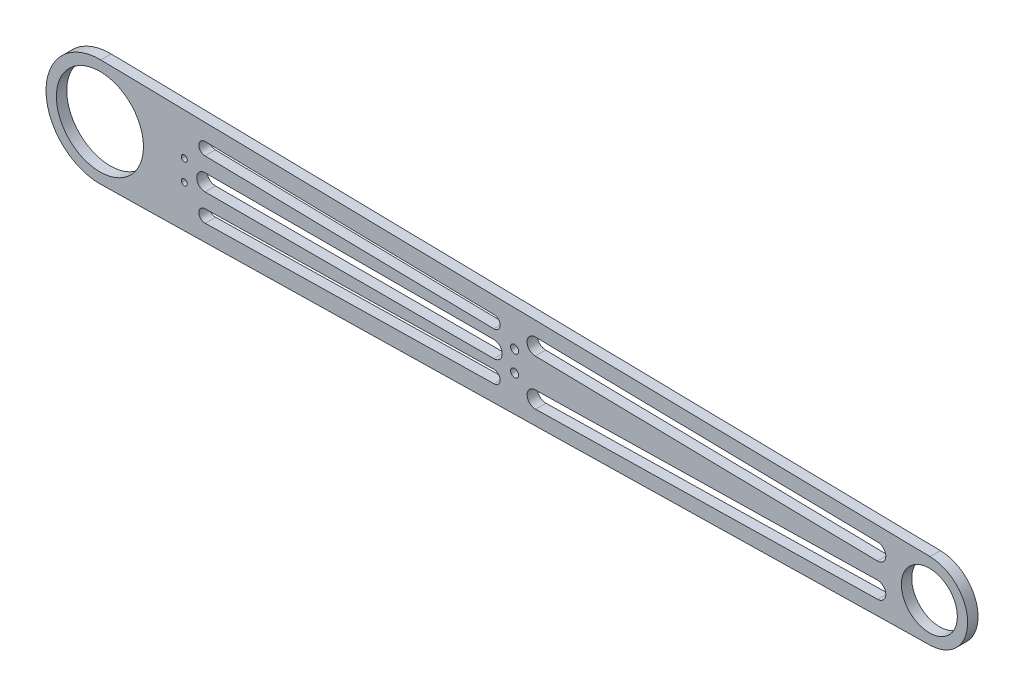
ISO-10303-21;
HEADER;
FILE_DESCRIPTION(('STEP AP214'),'2;1');
FILE_NAME('part.step','',(''),(''),'','','');
FILE_SCHEMA(('AUTOMOTIVE_DESIGN { 1 0 10303 214 1 1 1 1 }'));
ENDSEC;
DATA;
#1=APPLICATION_CONTEXT('core data for automotive mechanical design processes');
#2=APPLICATION_PROTOCOL_DEFINITION('international standard','automotive_design',2000,#1);
#3=PRODUCT_CONTEXT('',#1,'mechanical');
#4=PRODUCT('Part','Part','',(#3));
#5=PRODUCT_RELATED_PRODUCT_CATEGORY('part','',(#4));
#6=PRODUCT_DEFINITION_FORMATION('','',#4);
#7=PRODUCT_DEFINITION_CONTEXT('part definition',#1,'design');
#8=PRODUCT_DEFINITION('design','',#6,#7);
#9=PRODUCT_DEFINITION_SHAPE('','',#8);
#10=(LENGTH_UNIT() NAMED_UNIT(*) SI_UNIT(.MILLI.,.METRE.));
#11=(NAMED_UNIT(*) PLANE_ANGLE_UNIT() SI_UNIT($,.RADIAN.));
#12=(NAMED_UNIT(*) SI_UNIT($,.STERADIAN.) SOLID_ANGLE_UNIT());
#13=UNCERTAINTY_MEASURE_WITH_UNIT(LENGTH_MEASURE(1.E-05),#10,'distance_accuracy_value','');
#14=(GEOMETRIC_REPRESENTATION_CONTEXT(3) GLOBAL_UNCERTAINTY_ASSIGNED_CONTEXT((#13)) GLOBAL_UNIT_ASSIGNED_CONTEXT((#10,
#11,#12)) REPRESENTATION_CONTEXT('',''));
#15=CARTESIAN_POINT('',(0.,0.,0.));
#16=DIRECTION('',(0.,0.,1.));
#17=DIRECTION('',(1.,0.,0.));
#18=AXIS2_PLACEMENT_3D('',#15,#16,#17);
#19=CARTESIAN_POINT('',(0.,0.,5.));
#20=DIRECTION('',(0.,0.,1.));
#21=DIRECTION('',(1.,0.,0.));
#22=AXIS2_PLACEMENT_3D('',#19,#20,#21);
#23=PLANE('',#22);
#24=CARTESIAN_POINT('',(50.6939798987516,0.,5.));
#25=DIRECTION('',(0.,0.,1.));
#26=DIRECTION('',(1.,0.,0.));
#27=AXIS2_PLACEMENT_3D('',#24,#25,#26);
#28=CIRCLE('',#27,4.);
#29=CARTESIAN_POINT('',(50.6939798987516,4.,5.));
#30=VERTEX_POINT('',#29);
#31=CARTESIAN_POINT('',(50.6939798987516,-4.,5.));
#32=VERTEX_POINT('',#31);
#33=EDGE_CURVE('E56',#30,#32,#28,.T.);
#34=ORIENTED_EDGE('',*,*,#33,.F.);
#35=DIRECTION('',(-1.,0.,0.));
#36=VECTOR('',#35,1.);
#37=CARTESIAN_POINT('',(50.6939798987516,4.,5.));
#38=LINE('',#37,#36);
#39=CARTESIAN_POINT('',(190.,4.,5.));
#40=VERTEX_POINT('',#39);
#41=EDGE_CURVE('E314',#40,#30,#38,.T.);
#42=ORIENTED_EDGE('',*,*,#41,.F.);
#43=CARTESIAN_POINT('',(190.,0.,5.));
#44=DIRECTION('',(0.,0.,1.));
#45=DIRECTION('',(1.,0.,0.));
#46=AXIS2_PLACEMENT_3D('',#43,#44,#45);
#47=CIRCLE('',#46,4.);
#48=CARTESIAN_POINT('',(190.,-4.,5.));
#49=VERTEX_POINT('',#48);
#50=EDGE_CURVE('E317',#49,#40,#47,.T.);
#51=ORIENTED_EDGE('',*,*,#50,.F.);
#52=DIRECTION('',(1.,0.,0.));
#53=VECTOR('',#52,1.);
#54=CARTESIAN_POINT('',(50.6939798987516,-4.,5.));
#55=LINE('',#54,#53);
#56=EDGE_CURVE('E321',#32,#49,#55,.T.);
#57=ORIENTED_EDGE('',*,*,#56,.F.);
#58=EDGE_LOOP('',(#34,#42,#51,#57));
#59=FACE_BOUND('',#58,.T.);
#60=CARTESIAN_POINT('',(50.6939798987516,-14.0519581648038,5.));
#61=DIRECTION('',(0.,0.,1.));
#62=DIRECTION('',(-1.,0.,0.));
#63=AXIS2_PLACEMENT_3D('',#60,#61,#62);
#64=CIRCLE('',#63,3.);
#65=CARTESIAN_POINT('',(50.6377298987516,-11.0524855549105,5.));
#66=VERTEX_POINT('',#65);
#67=CARTESIAN_POINT('',(50.7502298987516,-17.0514307746971,5.));
#68=VERTEX_POINT('',#67);
#69=EDGE_CURVE('E64',#66,#68,#64,.T.);
#70=ORIENTED_EDGE('',*,*,#69,.F.);
#71=DIRECTION('',(-0.99982420329776,-0.0187499999999999,0.));
#72=VECTOR('',#71,1.);
#73=CARTESIAN_POINT('',(50.6377298987516,-11.0524855549105,5.));
#74=LINE('',#73,#72);
#75=CARTESIAN_POINT('',(189.94375,-8.44003841842077,5.));
#76=VERTEX_POINT('',#75);
#77=EDGE_CURVE('E284',#76,#66,#74,.T.);
#78=ORIENTED_EDGE('',*,*,#77,.F.);
#79=CARTESIAN_POINT('',(190.,-11.439511028314,5.));
#80=DIRECTION('',(0.,0.,1.));
#81=DIRECTION('',(-1.,0.,0.));
#82=AXIS2_PLACEMENT_3D('',#79,#80,#81);
#83=CIRCLE('',#82,2.99999999999999);
#84=CARTESIAN_POINT('',(190.05625,-14.4389836382073,5.));
#85=VERTEX_POINT('',#84);
#86=EDGE_CURVE('E287',#85,#76,#83,.T.);
#87=ORIENTED_EDGE('',*,*,#86,.F.);
#88=DIRECTION('',(0.99982420329776,0.0187499999999999,0.));
#89=VECTOR('',#88,1.);
#90=CARTESIAN_POINT('',(50.7502298987516,-17.0514307746971,5.));
#91=LINE('',#90,#89);
#92=EDGE_CURVE('E291',#68,#85,#91,.T.);
#93=ORIENTED_EDGE('',*,*,#92,.F.);
#94=EDGE_LOOP('',(#70,#78,#87,#93));
#95=FACE_BOUND('',#94,.T.);
#96=CARTESIAN_POINT('',(210.,-11.0644450929595,5.));
#97=DIRECTION('',(0.,0.,1.));
#98=DIRECTION('',(-1.,0.,0.));
#99=AXIS2_PLACEMENT_3D('',#96,#97,#98);
#100=CIRCLE('',#99,4.00000000000001);
#101=CARTESIAN_POINT('',(209.925,-7.06514827976842,5.));
#102=VERTEX_POINT('',#101);
#103=CARTESIAN_POINT('',(210.075,-15.0637419061505,5.));
#104=VERTEX_POINT('',#103);
#105=EDGE_CURVE('E213',#102,#104,#100,.T.);
#106=ORIENTED_EDGE('',*,*,#105,.F.);
#107=DIRECTION('',(-0.99982420329776,-0.0187499999999999,0.));
#108=VECTOR('',#107,1.);
#109=CARTESIAN_POINT('',(209.925,-7.06514827976842,5.));
#110=LINE('',#109,#108);
#111=CARTESIAN_POINT('',(374.925,-3.97085431309334,5.));
#112=VERTEX_POINT('',#111);
#113=EDGE_CURVE('E254',#112,#102,#110,.T.);
#114=ORIENTED_EDGE('',*,*,#113,.F.);
#115=CARTESIAN_POINT('',(375.,-7.97015112628439,5.));
#116=DIRECTION('',(0.,0.,1.));
#117=DIRECTION('',(-1.,0.,0.));
#118=AXIS2_PLACEMENT_3D('',#115,#116,#117);
#119=CIRCLE('',#118,4.00000000000001);
#120=CARTESIAN_POINT('',(375.075,-11.9694479394754,5.));
#121=VERTEX_POINT('',#120);
#122=EDGE_CURVE('E257',#121,#112,#119,.T.);
#123=ORIENTED_EDGE('',*,*,#122,.F.);
#124=DIRECTION('',(0.99982420329776,0.0187499999999998,0.));
#125=VECTOR('',#124,1.);
#126=CARTESIAN_POINT('',(210.075,-15.0637419061505,5.));
#127=LINE('',#126,#125);
#128=EDGE_CURVE('E261',#104,#121,#127,.T.);
#129=ORIENTED_EDGE('',*,*,#128,.F.);
#130=EDGE_LOOP('',(#106,#114,#123,#129));
#131=FACE_BOUND('',#130,.T.);
#132=CARTESIAN_POINT('',(210.,11.0644450929595,5.));
#133=DIRECTION('',(0.,0.,1.));
#134=DIRECTION('',(1.,0.,0.));
#135=AXIS2_PLACEMENT_3D('',#132,#133,#134);
#136=CIRCLE('',#135,4.00000000000001);
#137=CARTESIAN_POINT('',(210.075,15.0637419061505,5.));
#138=VERTEX_POINT('',#137);
#139=CARTESIAN_POINT('',(209.925,7.06514827976843,5.));
#140=VERTEX_POINT('',#139);
#141=EDGE_CURVE('E205',#138,#140,#136,.T.);
#142=ORIENTED_EDGE('',*,*,#141,.F.);
#143=DIRECTION('',(-0.99982420329776,0.0187499999999998,0.));
#144=VECTOR('',#143,1.);
#145=CARTESIAN_POINT('',(210.075,15.0637419061505,5.));
#146=LINE('',#145,#144);
#147=CARTESIAN_POINT('',(375.075,11.9694479394754,5.));
#148=VERTEX_POINT('',#147);
#149=EDGE_CURVE('E216',#148,#138,#146,.T.);
#150=ORIENTED_EDGE('',*,*,#149,.F.);
#151=CARTESIAN_POINT('',(375.,7.97015112628439,5.));
#152=DIRECTION('',(0.,0.,1.));
#153=DIRECTION('',(1.,0.,0.));
#154=AXIS2_PLACEMENT_3D('',#151,#152,#153);
#155=CIRCLE('',#154,4.00000000000001);
#156=CARTESIAN_POINT('',(374.925,3.97085431309334,5.));
#157=VERTEX_POINT('',#156);
#158=EDGE_CURVE('E221',#157,#148,#155,.T.);
#159=ORIENTED_EDGE('',*,*,#158,.F.);
#160=DIRECTION('',(0.99982420329776,-0.0187499999999999,0.));
#161=VECTOR('',#160,1.);
#162=CARTESIAN_POINT('',(209.925,7.06514827976842,5.));
#163=LINE('',#162,#161);
#164=EDGE_CURVE('E226',#140,#157,#163,.T.);
#165=ORIENTED_EDGE('',*,*,#164,.F.);
#166=EDGE_LOOP('',(#142,#150,#159,#165));
#167=FACE_BOUND('',#166,.T.);
#168=CARTESIAN_POINT('',(50.6939798987516,14.0519581648038,5.));
#169=DIRECTION('',(0.,0.,1.));
#170=DIRECTION('',(1.,0.,0.));
#171=AXIS2_PLACEMENT_3D('',#168,#169,#170);
#172=CIRCLE('',#171,3.);
#173=CARTESIAN_POINT('',(50.7502298987516,17.0514307746971,5.));
#174=VERTEX_POINT('',#173);
#175=CARTESIAN_POINT('',(50.6377298987516,11.0524855549105,5.));
#176=VERTEX_POINT('',#175);
#177=EDGE_CURVE('E227',#174,#176,#172,.T.);
#178=ORIENTED_EDGE('',*,*,#177,.F.);
#179=DIRECTION('',(-0.99982420329776,0.0187499999999999,0.));
#180=VECTOR('',#179,1.);
#181=CARTESIAN_POINT('',(50.7502298987516,17.0514307746971,5.));
#182=LINE('',#181,#180);
#183=CARTESIAN_POINT('',(190.05625,14.4389836382073,5.));
#184=VERTEX_POINT('',#183);
#185=EDGE_CURVE('E339',#184,#174,#182,.T.);
#186=ORIENTED_EDGE('',*,*,#185,.F.);
#187=CARTESIAN_POINT('',(190.,11.439511028314,5.));
#188=DIRECTION('',(0.,0.,1.));
#189=DIRECTION('',(1.,0.,0.));
#190=AXIS2_PLACEMENT_3D('',#187,#188,#189);
#191=CIRCLE('',#190,2.99999999999999);
#192=CARTESIAN_POINT('',(189.94375,8.44003841842077,5.));
#193=VERTEX_POINT('',#192);
#194=EDGE_CURVE('E351',#193,#184,#191,.T.);
#195=ORIENTED_EDGE('',*,*,#194,.F.);
#196=DIRECTION('',(0.99982420329776,-0.0187499999999999,0.));
#197=VECTOR('',#196,1.);
#198=CARTESIAN_POINT('',(50.6377298987516,11.0524855549105,5.));
#199=LINE('',#198,#197);
#200=EDGE_CURVE('E229',#176,#193,#199,.T.);
#201=ORIENTED_EDGE('',*,*,#200,.F.);
#202=EDGE_LOOP('',(#178,#186,#195,#201));
#203=FACE_BOUND('',#202,.T.);
#204=CARTESIAN_POINT('',(200.,5.,5.));
#205=DIRECTION('',(0.,0.,-1.));
#206=DIRECTION('',(-1.,0.,0.));
#207=AXIS2_PLACEMENT_3D('',#204,#205,#206);
#208=CIRCLE('',#207,1.95);
#209=CARTESIAN_POINT('',(198.05,5.,5.));
#210=VERTEX_POINT('',#209);
#211=EDGE_CURVE('E365',#210,#210,#208,.T.);
#212=ORIENTED_EDGE('',*,*,#211,.T.);
#213=EDGE_LOOP('',(#212));
#214=FACE_BOUND('',#213,.T.);
#215=CARTESIAN_POINT('',(200.,-5.,5.));
#216=DIRECTION('',(0.,0.,-1.));
#217=DIRECTION('',(1.,0.,0.));
#218=AXIS2_PLACEMENT_3D('',#215,#216,#217);
#219=CIRCLE('',#218,1.95);
#220=CARTESIAN_POINT('',(201.95,-5.,5.));
#221=VERTEX_POINT('',#220);
#222=EDGE_CURVE('E358',#221,#221,#219,.T.);
#223=ORIENTED_EDGE('',*,*,#222,.T.);
#224=EDGE_LOOP('',(#223));
#225=FACE_BOUND('',#224,.T.);
#226=CARTESIAN_POINT('',(40.6939798987516,-5.00000000000001,5.));
#227=DIRECTION('',(0.,0.,-1.));
#228=DIRECTION('',(-1.,0.,0.));
#229=AXIS2_PLACEMENT_3D('',#226,#227,#228);
#230=CIRCLE('',#229,1.45);
#231=CARTESIAN_POINT('',(39.2439798987516,-5.00000000000001,5.));
#232=VERTEX_POINT('',#231);
#233=EDGE_CURVE('E377',#232,#232,#230,.T.);
#234=ORIENTED_EDGE('',*,*,#233,.T.);
#235=EDGE_LOOP('',(#234));
#236=FACE_BOUND('',#235,.T.);
#237=CARTESIAN_POINT('',(40.6939798987516,4.99999999999999,5.));
#238=DIRECTION('',(0.,0.,-1.));
#239=DIRECTION('',(1.,0.,0.));
#240=AXIS2_PLACEMENT_3D('',#237,#238,#239);
#241=CIRCLE('',#240,1.45);
#242=CARTESIAN_POINT('',(42.1439798987516,4.99999999999999,5.));
#243=VERTEX_POINT('',#242);
#244=EDGE_CURVE('E368',#243,#243,#241,.T.);
#245=ORIENTED_EDGE('',*,*,#244,.T.);
#246=EDGE_LOOP('',(#245));
#247=FACE_BOUND('',#246,.T.);
#248=CARTESIAN_POINT('',(0.,0.,5.));
#249=DIRECTION('',(0.,0.,1.));
#250=DIRECTION('',(1.,0.,0.));
#251=AXIS2_PLACEMENT_3D('',#248,#249,#250);
#252=CIRCLE('',#251,21.);
#253=CARTESIAN_POINT('',(21.,0.,5.));
#254=VERTEX_POINT('',#253);
#255=EDGE_CURVE('E395',#254,#254,#252,.T.);
#256=ORIENTED_EDGE('',*,*,#255,.F.);
#257=EDGE_LOOP('',(#256));
#258=FACE_BOUND('',#257,.T.);
#259=CARTESIAN_POINT('',(0.,0.,5.));
#260=DIRECTION('',(0.,0.,1.));
#261=DIRECTION('',(1.,0.,0.));
#262=AXIS2_PLACEMENT_3D('',#259,#260,#261);
#263=CIRCLE('',#262,26.);
#264=CARTESIAN_POINT('',(0.4875,25.9954292857418,5.));
#265=VERTEX_POINT('',#264);
#266=CARTESIAN_POINT('',(0.4875,-25.9954292857418,5.));
#267=VERTEX_POINT('',#266);
#268=EDGE_CURVE('E401',#265,#267,#263,.T.);
#269=ORIENTED_EDGE('',*,*,#268,.T.);
#270=DIRECTION('',(0.99982420329776,0.01875,0.));
#271=VECTOR('',#270,1.);
#272=CARTESIAN_POINT('',(0.4875,-25.9954292857418,5.));
#273=LINE('',#272,#271);
#274=CARTESIAN_POINT('',(400.346875,-18.4967477610086,5.));
#275=VERTEX_POINT('',#274);
#276=EDGE_CURVE('E404',#267,#275,#273,.T.);
#277=ORIENTED_EDGE('',*,*,#276,.T.);
#278=CARTESIAN_POINT('',(400.,0.,5.));
#279=DIRECTION('',(0.,0.,1.));
#280=DIRECTION('',(1.,0.,0.));
#281=AXIS2_PLACEMENT_3D('',#278,#279,#280);
#282=CIRCLE('',#281,18.5);
#283=CARTESIAN_POINT('',(400.346875,18.4967477610086,5.));
#284=VERTEX_POINT('',#283);
#285=EDGE_CURVE('E407',#275,#284,#282,.T.);
#286=ORIENTED_EDGE('',*,*,#285,.T.);
#287=DIRECTION('',(-0.99982420329776,0.01875,0.));
#288=VECTOR('',#287,1.);
#289=CARTESIAN_POINT('',(400.346875,18.4967477610086,5.));
#290=LINE('',#289,#288);
#291=EDGE_CURVE('E409',#284,#265,#290,.T.);
#292=ORIENTED_EDGE('',*,*,#291,.T.);
#293=EDGE_LOOP('',(#269,#277,#286,#292));
#294=FACE_BOUND('',#293,.T.);
#295=CARTESIAN_POINT('',(400.,0.,5.));
#296=DIRECTION('',(0.,0.,1.));
#297=DIRECTION('',(1.,0.,0.));
#298=AXIS2_PLACEMENT_3D('',#295,#296,#297);
#299=CIRCLE('',#298,13.5);
#300=CARTESIAN_POINT('',(413.5,0.,5.));
#301=VERTEX_POINT('',#300);
#302=EDGE_CURVE('E389',#301,#301,#299,.T.);
#303=ORIENTED_EDGE('',*,*,#302,.F.);
#304=EDGE_LOOP('',(#303));
#305=FACE_BOUND('',#304,.T.);
#306=ADVANCED_FACE('F41',(#59,#95,#131,#167,#203,#214,#225,#236,#247,#258,#294,#305),#23,.T.);
#307=CARTESIAN_POINT('',(0.,0.,0.));
#308=DIRECTION('',(0.,0.,1.));
#309=DIRECTION('',(1.,0.,0.));
#310=AXIS2_PLACEMENT_3D('',#307,#308,#309);
#311=PLANE('',#310);
#312=DIRECTION('',(-1.,0.,0.));
#313=VECTOR('',#312,1.);
#314=CARTESIAN_POINT('',(50.6939798987516,4.,0.));
#315=LINE('',#314,#313);
#316=CARTESIAN_POINT('',(190.,4.,0.));
#317=VERTEX_POINT('',#316);
#318=CARTESIAN_POINT('',(50.6939798987516,4.,0.));
#319=VERTEX_POINT('',#318);
#320=EDGE_CURVE('E307',#317,#319,#315,.T.);
#321=ORIENTED_EDGE('',*,*,#320,.T.);
#322=CARTESIAN_POINT('',(50.6939798987516,0.,0.));
#323=DIRECTION('',(0.,0.,1.));
#324=DIRECTION('',(1.,0.,0.));
#325=AXIS2_PLACEMENT_3D('',#322,#323,#324);
#326=CIRCLE('',#325,4.);
#327=CARTESIAN_POINT('',(50.6939798987516,-4.,0.));
#328=VERTEX_POINT('',#327);
#329=EDGE_CURVE('E318',#319,#328,#326,.T.);
#330=ORIENTED_EDGE('',*,*,#329,.T.);
#331=DIRECTION('',(1.,0.,0.));
#332=VECTOR('',#331,1.);
#333=CARTESIAN_POINT('',(50.6939798987516,-4.,0.));
#334=LINE('',#333,#332);
#335=CARTESIAN_POINT('',(190.,-4.,0.));
#336=VERTEX_POINT('',#335);
#337=EDGE_CURVE('E330',#328,#336,#334,.T.);
#338=ORIENTED_EDGE('',*,*,#337,.T.);
#339=CARTESIAN_POINT('',(190.,0.,0.));
#340=DIRECTION('',(0.,0.,1.));
#341=DIRECTION('',(1.,0.,0.));
#342=AXIS2_PLACEMENT_3D('',#339,#340,#341);
#343=CIRCLE('',#342,4.);
#344=EDGE_CURVE('E327',#336,#317,#343,.T.);
#345=ORIENTED_EDGE('',*,*,#344,.T.);
#346=EDGE_LOOP('',(#321,#330,#338,#345));
#347=FACE_BOUND('',#346,.T.);
#348=DIRECTION('',(-0.99982420329776,-0.0187499999999999,0.));
#349=VECTOR('',#348,1.);
#350=CARTESIAN_POINT('',(50.6377298987516,-11.0524855549105,0.));
#351=LINE('',#350,#349);
#352=CARTESIAN_POINT('',(189.94375,-8.44003841842077,0.));
#353=VERTEX_POINT('',#352);
#354=CARTESIAN_POINT('',(50.6377298987516,-11.0524855549105,0.));
#355=VERTEX_POINT('',#354);
#356=EDGE_CURVE('E277',#353,#355,#351,.T.);
#357=ORIENTED_EDGE('',*,*,#356,.T.);
#358=CARTESIAN_POINT('',(50.6939798987516,-14.0519581648038,0.));
#359=DIRECTION('',(0.,0.,1.));
#360=DIRECTION('',(-1.,0.,0.));
#361=AXIS2_PLACEMENT_3D('',#358,#359,#360);
#362=CIRCLE('',#361,3.);
#363=CARTESIAN_POINT('',(50.7502298987516,-17.0514307746971,0.));
#364=VERTEX_POINT('',#363);
#365=EDGE_CURVE('E288',#355,#364,#362,.T.);
#366=ORIENTED_EDGE('',*,*,#365,.T.);
#367=DIRECTION('',(0.99982420329776,0.0187499999999999,0.));
#368=VECTOR('',#367,1.);
#369=CARTESIAN_POINT('',(50.7502298987516,-17.0514307746971,0.));
#370=LINE('',#369,#368);
#371=CARTESIAN_POINT('',(190.05625,-14.4389836382073,0.));
#372=VERTEX_POINT('',#371);
#373=EDGE_CURVE('E300',#364,#372,#370,.T.);
#374=ORIENTED_EDGE('',*,*,#373,.T.);
#375=CARTESIAN_POINT('',(190.,-11.439511028314,0.));
#376=DIRECTION('',(0.,0.,1.));
#377=DIRECTION('',(-1.,0.,0.));
#378=AXIS2_PLACEMENT_3D('',#375,#376,#377);
#379=CIRCLE('',#378,2.99999999999999);
#380=EDGE_CURVE('E297',#372,#353,#379,.T.);
#381=ORIENTED_EDGE('',*,*,#380,.T.);
#382=EDGE_LOOP('',(#357,#366,#374,#381));
#383=FACE_BOUND('',#382,.T.);
#384=DIRECTION('',(-0.99982420329776,-0.0187499999999999,0.));
#385=VECTOR('',#384,1.);
#386=CARTESIAN_POINT('',(209.925,-7.06514827976842,0.));
#387=LINE('',#386,#385);
#388=CARTESIAN_POINT('',(374.925,-3.97085431309334,0.));
#389=VERTEX_POINT('',#388);
#390=CARTESIAN_POINT('',(209.925,-7.06514827976842,0.));
#391=VERTEX_POINT('',#390);
#392=EDGE_CURVE('E247',#389,#391,#387,.T.);
#393=ORIENTED_EDGE('',*,*,#392,.T.);
#394=CARTESIAN_POINT('',(210.,-11.0644450929595,0.));
#395=DIRECTION('',(0.,0.,1.));
#396=DIRECTION('',(-1.,0.,0.));
#397=AXIS2_PLACEMENT_3D('',#394,#395,#396);
#398=CIRCLE('',#397,4.00000000000001);
#399=CARTESIAN_POINT('',(210.075,-15.0637419061505,0.));
#400=VERTEX_POINT('',#399);
#401=EDGE_CURVE('E258',#391,#400,#398,.T.);
#402=ORIENTED_EDGE('',*,*,#401,.T.);
#403=DIRECTION('',(0.99982420329776,0.0187499999999998,0.));
#404=VECTOR('',#403,1.);
#405=CARTESIAN_POINT('',(210.075,-15.0637419061505,0.));
#406=LINE('',#405,#404);
#407=CARTESIAN_POINT('',(375.075,-11.9694479394754,0.));
#408=VERTEX_POINT('',#407);
#409=EDGE_CURVE('E270',#400,#408,#406,.T.);
#410=ORIENTED_EDGE('',*,*,#409,.T.);
#411=CARTESIAN_POINT('',(375.,-7.97015112628439,0.));
#412=DIRECTION('',(0.,0.,1.));
#413=DIRECTION('',(-1.,0.,0.));
#414=AXIS2_PLACEMENT_3D('',#411,#412,#413);
#415=CIRCLE('',#414,4.00000000000001);
#416=EDGE_CURVE('E267',#408,#389,#415,.T.);
#417=ORIENTED_EDGE('',*,*,#416,.T.);
#418=EDGE_LOOP('',(#393,#402,#410,#417));
#419=FACE_BOUND('',#418,.T.);
#420=DIRECTION('',(-0.99982420329776,0.0187499999999998,0.));
#421=VECTOR('',#420,1.);
#422=CARTESIAN_POINT('',(210.075,15.0637419061505,0.));
#423=LINE('',#422,#421);
#424=CARTESIAN_POINT('',(375.075,11.9694479394754,0.));
#425=VERTEX_POINT('',#424);
#426=CARTESIAN_POINT('',(210.075,15.0637419061505,0.));
#427=VERTEX_POINT('',#426);
#428=EDGE_CURVE('E234',#425,#427,#423,.T.);
#429=ORIENTED_EDGE('',*,*,#428,.T.);
#430=CARTESIAN_POINT('',(210.,11.0644450929595,0.));
#431=DIRECTION('',(0.,0.,1.));
#432=DIRECTION('',(1.,0.,0.));
#433=AXIS2_PLACEMENT_3D('',#430,#431,#432);
#434=CIRCLE('',#433,4.00000000000001);
#435=CARTESIAN_POINT('',(209.925,7.06514827976842,0.));
#436=VERTEX_POINT('',#435);
#437=EDGE_CURVE('E208',#427,#436,#434,.T.);
#438=ORIENTED_EDGE('',*,*,#437,.T.);
#439=DIRECTION('',(0.99982420329776,-0.0187499999999999,0.));
#440=VECTOR('',#439,1.);
#441=CARTESIAN_POINT('',(209.925,7.06514827976842,0.));
#442=LINE('',#441,#440);
#443=CARTESIAN_POINT('',(374.925,3.97085431309334,0.));
#444=VERTEX_POINT('',#443);
#445=EDGE_CURVE('E240',#436,#444,#442,.T.);
#446=ORIENTED_EDGE('',*,*,#445,.T.);
#447=CARTESIAN_POINT('',(375.,7.97015112628439,0.));
#448=DIRECTION('',(0.,0.,1.));
#449=DIRECTION('',(1.,0.,0.));
#450=AXIS2_PLACEMENT_3D('',#447,#448,#449);
#451=CIRCLE('',#450,4.00000000000001);
#452=EDGE_CURVE('E236',#444,#425,#451,.T.);
#453=ORIENTED_EDGE('',*,*,#452,.T.);
#454=EDGE_LOOP('',(#429,#438,#446,#453));
#455=FACE_BOUND('',#454,.T.);
#456=DIRECTION('',(-0.99982420329776,0.0187499999999999,0.));
#457=VECTOR('',#456,1.);
#458=CARTESIAN_POINT('',(50.7502298987516,17.0514307746971,0.));
#459=LINE('',#458,#457);
#460=CARTESIAN_POINT('',(190.05625,14.4389836382073,0.));
#461=VERTEX_POINT('',#460);
#462=CARTESIAN_POINT('',(50.7502298987516,17.0514307746971,0.));
#463=VERTEX_POINT('',#462);
#464=EDGE_CURVE('E345',#461,#463,#459,.T.);
#465=ORIENTED_EDGE('',*,*,#464,.T.);
#466=CARTESIAN_POINT('',(50.6939798987516,14.0519581648038,0.));
#467=DIRECTION('',(0.,0.,1.));
#468=DIRECTION('',(1.,0.,0.));
#469=AXIS2_PLACEMENT_3D('',#466,#467,#468);
#470=CIRCLE('',#469,3.);
#471=CARTESIAN_POINT('',(50.6377298987516,11.0524855549105,0.));
#472=VERTEX_POINT('',#471);
#473=EDGE_CURVE('E335',#463,#472,#470,.T.);
#474=ORIENTED_EDGE('',*,*,#473,.T.);
#475=DIRECTION('',(0.99982420329776,-0.0187499999999999,0.));
#476=VECTOR('',#475,1.);
#477=CARTESIAN_POINT('',(50.6377298987516,11.0524855549105,0.));
#478=LINE('',#477,#476);
#479=CARTESIAN_POINT('',(189.94375,8.44003841842077,0.));
#480=VERTEX_POINT('',#479);
#481=EDGE_CURVE('E338',#472,#480,#478,.T.);
#482=ORIENTED_EDGE('',*,*,#481,.T.);
#483=CARTESIAN_POINT('',(190.,11.439511028314,0.));
#484=DIRECTION('',(0.,0.,1.));
#485=DIRECTION('',(1.,0.,0.));
#486=AXIS2_PLACEMENT_3D('',#483,#484,#485);
#487=CIRCLE('',#486,2.99999999999999);
#488=EDGE_CURVE('E342',#480,#461,#487,.T.);
#489=ORIENTED_EDGE('',*,*,#488,.T.);
#490=EDGE_LOOP('',(#465,#474,#482,#489));
#491=FACE_BOUND('',#490,.T.);
#492=CARTESIAN_POINT('',(200.,5.,0.));
#493=DIRECTION('',(0.,0.,-1.));
#494=DIRECTION('',(-1.,0.,0.));
#495=AXIS2_PLACEMENT_3D('',#492,#493,#494);
#496=CIRCLE('',#495,1.95);
#497=CARTESIAN_POINT('',(198.05,5.,0.));
#498=VERTEX_POINT('',#497);
#499=EDGE_CURVE('E369',#498,#498,#496,.T.);
#500=ORIENTED_EDGE('',*,*,#499,.F.);
#501=EDGE_LOOP('',(#500));
#502=FACE_BOUND('',#501,.T.);
#503=CARTESIAN_POINT('',(200.,-5.,0.));
#504=DIRECTION('',(0.,0.,-1.));
#505=DIRECTION('',(1.,0.,0.));
#506=AXIS2_PLACEMENT_3D('',#503,#504,#505);
#507=CIRCLE('',#506,1.95);
#508=CARTESIAN_POINT('',(201.95,-5.,0.));
#509=VERTEX_POINT('',#508);
#510=EDGE_CURVE('E372',#509,#509,#507,.T.);
#511=ORIENTED_EDGE('',*,*,#510,.F.);
#512=EDGE_LOOP('',(#511));
#513=FACE_BOUND('',#512,.T.);
#514=CARTESIAN_POINT('',(40.6939798987516,-5.00000000000001,0.));
#515=DIRECTION('',(0.,0.,-1.));
#516=DIRECTION('',(-1.,0.,0.));
#517=AXIS2_PLACEMENT_3D('',#514,#515,#516);
#518=CIRCLE('',#517,1.45);
#519=CARTESIAN_POINT('',(39.2439798987516,-5.00000000000001,0.));
#520=VERTEX_POINT('',#519);
#521=EDGE_CURVE('E381',#520,#520,#518,.T.);
#522=ORIENTED_EDGE('',*,*,#521,.F.);
#523=EDGE_LOOP('',(#522));
#524=FACE_BOUND('',#523,.T.);
#525=CARTESIAN_POINT('',(40.6939798987516,4.99999999999999,0.));
#526=DIRECTION('',(0.,0.,-1.));
#527=DIRECTION('',(1.,0.,0.));
#528=AXIS2_PLACEMENT_3D('',#525,#526,#527);
#529=CIRCLE('',#528,1.45);
#530=CARTESIAN_POINT('',(42.1439798987516,4.99999999999999,0.));
#531=VERTEX_POINT('',#530);
#532=EDGE_CURVE('E384',#531,#531,#529,.T.);
#533=ORIENTED_EDGE('',*,*,#532,.F.);
#534=EDGE_LOOP('',(#533));
#535=FACE_BOUND('',#534,.T.);
#536=CARTESIAN_POINT('',(0.,0.,0.));
#537=DIRECTION('',(0.,0.,1.));
#538=DIRECTION('',(1.,0.,0.));
#539=AXIS2_PLACEMENT_3D('',#536,#537,#538);
#540=CIRCLE('',#539,26.);
#541=CARTESIAN_POINT('',(0.4875,25.9954292857418,0.));
#542=VERTEX_POINT('',#541);
#543=CARTESIAN_POINT('',(0.4875,-25.9954292857418,0.));
#544=VERTEX_POINT('',#543);
#545=EDGE_CURVE('E398',#542,#544,#540,.T.);
#546=ORIENTED_EDGE('',*,*,#545,.F.);
#547=DIRECTION('',(-0.99982420329776,0.01875,0.));
#548=VECTOR('',#547,1.);
#549=CARTESIAN_POINT('',(400.346875,18.4967477610086,0.));
#550=LINE('',#549,#548);
#551=CARTESIAN_POINT('',(400.346875,18.4967477610086,0.));
#552=VERTEX_POINT('',#551);
#553=EDGE_CURVE('E405',#552,#542,#550,.T.);
#554=ORIENTED_EDGE('',*,*,#553,.F.);
#555=CARTESIAN_POINT('',(400.,0.,0.));
#556=DIRECTION('',(0.,0.,1.));
#557=DIRECTION('',(1.,0.,0.));
#558=AXIS2_PLACEMENT_3D('',#555,#556,#557);
#559=CIRCLE('',#558,18.5);
#560=CARTESIAN_POINT('',(400.346875,-18.4967477610086,0.));
#561=VERTEX_POINT('',#560);
#562=EDGE_CURVE('E416',#561,#552,#559,.T.);
#563=ORIENTED_EDGE('',*,*,#562,.F.);
#564=DIRECTION('',(0.99982420329776,0.01875,0.));
#565=VECTOR('',#564,1.);
#566=CARTESIAN_POINT('',(0.4875,-25.9954292857418,0.));
#567=LINE('',#566,#565);
#568=EDGE_CURVE('E414',#544,#561,#567,.T.);
#569=ORIENTED_EDGE('',*,*,#568,.F.);
#570=EDGE_LOOP('',(#546,#554,#563,#569));
#571=FACE_BOUND('',#570,.T.);
#572=CARTESIAN_POINT('',(0.,0.,0.));
#573=DIRECTION('',(0.,0.,1.));
#574=DIRECTION('',(1.,0.,0.));
#575=AXIS2_PLACEMENT_3D('',#572,#573,#574);
#576=CIRCLE('',#575,21.);
#577=CARTESIAN_POINT('',(21.,0.,0.));
#578=VERTEX_POINT('',#577);
#579=EDGE_CURVE('E392',#578,#578,#576,.T.);
#580=ORIENTED_EDGE('',*,*,#579,.T.);
#581=EDGE_LOOP('',(#580));
#582=FACE_BOUND('',#581,.T.);
#583=CARTESIAN_POINT('',(400.,0.,0.));
#584=DIRECTION('',(0.,0.,1.));
#585=DIRECTION('',(1.,0.,0.));
#586=AXIS2_PLACEMENT_3D('',#583,#584,#585);
#587=CIRCLE('',#586,13.5);
#588=CARTESIAN_POINT('',(413.5,0.,0.));
#589=VERTEX_POINT('',#588);
#590=EDGE_CURVE('E380',#589,#589,#587,.T.);
#591=ORIENTED_EDGE('',*,*,#590,.T.);
#592=EDGE_LOOP('',(#591));
#593=FACE_BOUND('',#592,.T.);
#594=ADVANCED_FACE('F434',(#347,#383,#419,#455,#491,#502,#513,#524,#535,#571,#582,#593),#311,.F.);
#595=CARTESIAN_POINT('',(0.,0.,5.));
#596=DIRECTION('',(0.,0.,-1.));
#597=DIRECTION('',(-1.,0.,0.));
#598=AXIS2_PLACEMENT_3D('',#595,#596,#597);
#599=CYLINDRICAL_SURFACE('',#598,26.);
#600=ORIENTED_EDGE('',*,*,#545,.T.);
#601=DIRECTION('',(0.,0.,-1.));
#602=VECTOR('',#601,1.);
#603=CARTESIAN_POINT('',(0.4875,-25.9954292857418,5.));
#604=LINE('',#603,#602);
#605=EDGE_CURVE('E11',#267,#544,#604,.T.);
#606=ORIENTED_EDGE('',*,*,#605,.F.);
#607=ORIENTED_EDGE('',*,*,#268,.F.);
#608=DIRECTION('',(0.,0.,-1.));
#609=VECTOR('',#608,1.);
#610=CARTESIAN_POINT('',(0.4875,25.9954292857418,5.));
#611=LINE('',#610,#609);
#612=EDGE_CURVE('E411',#265,#542,#611,.T.);
#613=ORIENTED_EDGE('',*,*,#612,.T.);
#614=EDGE_LOOP('',(#600,#606,#607,#613));
#615=FACE_BOUND('',#614,.T.);
#616=ADVANCED_FACE('F43',(#615),#599,.T.);
#617=CARTESIAN_POINT('',(0.4875,-25.9954292857418,5.));
#618=DIRECTION('',(-0.01875,0.99982420329776,0.));
#619=DIRECTION('',(-0.99982420329776,-0.01875,0.));
#620=AXIS2_PLACEMENT_3D('',#617,#618,#619);
#621=PLANE('',#620);
#622=ORIENTED_EDGE('',*,*,#568,.T.);
#623=DIRECTION('',(0.,0.,-1.));
#624=VECTOR('',#623,1.);
#625=CARTESIAN_POINT('',(400.346875,-18.4967477610086,5.));
#626=LINE('',#625,#624);
#627=EDGE_CURVE('E49',#275,#561,#626,.T.);
#628=ORIENTED_EDGE('',*,*,#627,.F.);
#629=ORIENTED_EDGE('',*,*,#276,.F.);
#630=ORIENTED_EDGE('',*,*,#605,.T.);
#631=EDGE_LOOP('',(#622,#628,#629,#630));
#632=FACE_BOUND('',#631,.T.);
#633=ADVANCED_FACE('F445',(#632),#621,.F.);
#634=CARTESIAN_POINT('',(400.,0.,5.));
#635=DIRECTION('',(0.,0.,-1.));
#636=DIRECTION('',(-1.,0.,0.));
#637=AXIS2_PLACEMENT_3D('',#634,#635,#636);
#638=CYLINDRICAL_SURFACE('',#637,18.5);
#639=ORIENTED_EDGE('',*,*,#562,.T.);
#640=DIRECTION('',(0.,0.,-1.));
#641=VECTOR('',#640,1.);
#642=CARTESIAN_POINT('',(400.346875,18.4967477610086,5.));
#643=LINE('',#642,#641);
#644=EDGE_CURVE('E421',#284,#552,#643,.T.);
#645=ORIENTED_EDGE('',*,*,#644,.F.);
#646=ORIENTED_EDGE('',*,*,#285,.F.);
#647=ORIENTED_EDGE('',*,*,#627,.T.);
#648=EDGE_LOOP('',(#639,#645,#646,#647));
#649=FACE_BOUND('',#648,.T.);
#650=ADVANCED_FACE('F428',(#649),#638,.T.);
#651=CARTESIAN_POINT('',(400.346875,18.4967477610086,5.));
#652=DIRECTION('',(-0.01875,-0.99982420329776,0.));
#653=DIRECTION('',(0.99982420329776,-0.01875,0.));
#654=AXIS2_PLACEMENT_3D('',#651,#652,#653);
#655=PLANE('',#654);
#656=ORIENTED_EDGE('',*,*,#553,.T.);
#657=ORIENTED_EDGE('',*,*,#612,.F.);
#658=ORIENTED_EDGE('',*,*,#291,.F.);
#659=ORIENTED_EDGE('',*,*,#644,.T.);
#660=EDGE_LOOP('',(#656,#657,#658,#659));
#661=FACE_BOUND('',#660,.T.);
#662=ADVANCED_FACE('F438',(#661),#655,.F.);
#663=CARTESIAN_POINT('',(0.,0.,5.));
#664=DIRECTION('',(0.,0.,-1.));
#665=DIRECTION('',(-1.,0.,0.));
#666=AXIS2_PLACEMENT_3D('',#663,#664,#665);
#667=CYLINDRICAL_SURFACE('',#666,21.);
#668=ORIENTED_EDGE('',*,*,#255,.T.);
#669=EDGE_LOOP('',(#668));
#670=FACE_BOUND('',#669,.T.);
#671=ORIENTED_EDGE('',*,*,#579,.F.);
#672=EDGE_LOOP('',(#671));
#673=FACE_BOUND('',#672,.T.);
#674=ADVANCED_FACE('F463',(#670,#673),#667,.F.);
#675=CARTESIAN_POINT('',(400.,0.,5.));
#676=DIRECTION('',(0.,0.,-1.));
#677=DIRECTION('',(-1.,0.,0.));
#678=AXIS2_PLACEMENT_3D('',#675,#676,#677);
#679=CYLINDRICAL_SURFACE('',#678,13.5);
#680=ORIENTED_EDGE('',*,*,#302,.T.);
#681=EDGE_LOOP('',(#680));
#682=FACE_BOUND('',#681,.T.);
#683=ORIENTED_EDGE('',*,*,#590,.F.);
#684=EDGE_LOOP('',(#683));
#685=FACE_BOUND('',#684,.T.);
#686=ADVANCED_FACE('F470',(#682,#685),#679,.F.);
#687=CARTESIAN_POINT('',(40.6939798987516,4.99999999999999,5.));
#688=DIRECTION('',(0.,0.,-1.));
#689=DIRECTION('',(-1.,0.,0.));
#690=AXIS2_PLACEMENT_3D('',#687,#688,#689);
#691=CYLINDRICAL_SURFACE('',#690,1.45);
#692=ORIENTED_EDGE('',*,*,#244,.F.);
#693=EDGE_LOOP('',(#692));
#694=FACE_BOUND('',#693,.T.);
#695=ORIENTED_EDGE('',*,*,#532,.T.);
#696=EDGE_LOOP('',(#695));
#697=FACE_BOUND('',#696,.T.);
#698=ADVANCED_FACE('F475',(#694,#697),#691,.F.);
#699=CARTESIAN_POINT('',(40.6939798987516,-5.00000000000001,5.));
#700=DIRECTION('',(0.,0.,-1.));
#701=DIRECTION('',(-1.,0.,0.));
#702=AXIS2_PLACEMENT_3D('',#699,#700,#701);
#703=CYLINDRICAL_SURFACE('',#702,1.45);
#704=ORIENTED_EDGE('',*,*,#233,.F.);
#705=EDGE_LOOP('',(#704));
#706=FACE_BOUND('',#705,.T.);
#707=ORIENTED_EDGE('',*,*,#521,.T.);
#708=EDGE_LOOP('',(#707));
#709=FACE_BOUND('',#708,.T.);
#710=ADVANCED_FACE('F487',(#706,#709),#703,.F.);
#711=CARTESIAN_POINT('',(200.,-5.,5.));
#712=DIRECTION('',(0.,0.,-1.));
#713=DIRECTION('',(-1.,0.,0.));
#714=AXIS2_PLACEMENT_3D('',#711,#712,#713);
#715=CYLINDRICAL_SURFACE('',#714,1.95);
#716=ORIENTED_EDGE('',*,*,#222,.F.);
#717=EDGE_LOOP('',(#716));
#718=FACE_BOUND('',#717,.T.);
#719=ORIENTED_EDGE('',*,*,#510,.T.);
#720=EDGE_LOOP('',(#719));
#721=FACE_BOUND('',#720,.T.);
#722=ADVANCED_FACE('F493',(#718,#721),#715,.F.);
#723=CARTESIAN_POINT('',(200.,5.,5.));
#724=DIRECTION('',(0.,0.,-1.));
#725=DIRECTION('',(-1.,0.,0.));
#726=AXIS2_PLACEMENT_3D('',#723,#724,#725);
#727=CYLINDRICAL_SURFACE('',#726,1.95);
#728=ORIENTED_EDGE('',*,*,#211,.F.);
#729=EDGE_LOOP('',(#728));
#730=FACE_BOUND('',#729,.T.);
#731=ORIENTED_EDGE('',*,*,#499,.T.);
#732=EDGE_LOOP('',(#731));
#733=FACE_BOUND('',#732,.T.);
#734=ADVANCED_FACE('F497',(#730,#733),#727,.F.);
#735=CARTESIAN_POINT('',(50.6939798987516,14.0519581648038,0.));
#736=DIRECTION('',(0.,0.,1.));
#737=DIRECTION('',(1.,0.,0.));
#738=AXIS2_PLACEMENT_3D('',#735,#736,#737);
#739=CYLINDRICAL_SURFACE('',#738,3.);
#740=ORIENTED_EDGE('',*,*,#177,.T.);
#741=DIRECTION('',(0.,0.,1.));
#742=VECTOR('',#741,1.);
#743=CARTESIAN_POINT('',(50.6377298987516,11.0524855549105,0.));
#744=LINE('',#743,#742);
#745=EDGE_CURVE('E347',#472,#176,#744,.T.);
#746=ORIENTED_EDGE('',*,*,#745,.F.);
#747=ORIENTED_EDGE('',*,*,#473,.F.);
#748=DIRECTION('',(0.,0.,1.));
#749=VECTOR('',#748,1.);
#750=CARTESIAN_POINT('',(50.7502298987516,17.0514307746971,0.));
#751=LINE('',#750,#749);
#752=EDGE_CURVE('E356',#463,#174,#751,.T.);
#753=ORIENTED_EDGE('',*,*,#752,.T.);
#754=EDGE_LOOP('',(#740,#746,#747,#753));
#755=FACE_BOUND('',#754,.T.);
#756=ADVANCED_FACE('F500',(#755),#739,.F.);
#757=CARTESIAN_POINT('',(50.7502298987516,17.0514307746971,0.));
#758=DIRECTION('',(0.0187499999999999,0.99982420329776,0.));
#759=DIRECTION('',(-0.99982420329776,0.0187499999999999,0.));
#760=AXIS2_PLACEMENT_3D('',#757,#758,#759);
#761=PLANE('',#760);
#762=ORIENTED_EDGE('',*,*,#185,.T.);
#763=ORIENTED_EDGE('',*,*,#752,.F.);
#764=ORIENTED_EDGE('',*,*,#464,.F.);
#765=DIRECTION('',(0.,0.,1.));
#766=VECTOR('',#765,1.);
#767=CARTESIAN_POINT('',(190.05625,14.4389836382073,0.));
#768=LINE('',#767,#766);
#769=EDGE_CURVE('E359',#461,#184,#768,.T.);
#770=ORIENTED_EDGE('',*,*,#769,.T.);
#771=EDGE_LOOP('',(#762,#763,#764,#770));
#772=FACE_BOUND('',#771,.T.);
#773=ADVANCED_FACE('F504',(#772),#761,.F.);
#774=CARTESIAN_POINT('',(190.,11.439511028314,0.));
#775=DIRECTION('',(0.,0.,1.));
#776=DIRECTION('',(1.,0.,0.));
#777=AXIS2_PLACEMENT_3D('',#774,#775,#776);
#778=CYLINDRICAL_SURFACE('',#777,2.99999999999999);
#779=ORIENTED_EDGE('',*,*,#194,.T.);
#780=ORIENTED_EDGE('',*,*,#769,.F.);
#781=ORIENTED_EDGE('',*,*,#488,.F.);
#782=DIRECTION('',(0.,0.,1.));
#783=VECTOR('',#782,1.);
#784=CARTESIAN_POINT('',(189.94375,8.44003841842077,0.));
#785=LINE('',#784,#783);
#786=EDGE_CURVE('E361',#480,#193,#785,.T.);
#787=ORIENTED_EDGE('',*,*,#786,.T.);
#788=EDGE_LOOP('',(#779,#780,#781,#787));
#789=FACE_BOUND('',#788,.T.);
#790=ADVANCED_FACE('F509',(#789),#778,.F.);
#791=CARTESIAN_POINT('',(50.6377298987516,11.0524855549105,0.));
#792=DIRECTION('',(-0.0187499999999999,-0.99982420329776,0.));
#793=DIRECTION('',(0.99982420329776,-0.0187499999999999,0.));
#794=AXIS2_PLACEMENT_3D('',#791,#792,#793);
#795=PLANE('',#794);
#796=ORIENTED_EDGE('',*,*,#200,.T.);
#797=ORIENTED_EDGE('',*,*,#786,.F.);
#798=ORIENTED_EDGE('',*,*,#481,.F.);
#799=ORIENTED_EDGE('',*,*,#745,.T.);
#800=EDGE_LOOP('',(#796,#797,#798,#799));
#801=FACE_BOUND('',#800,.T.);
#802=ADVANCED_FACE('F506',(#801),#795,.F.);
#803=CARTESIAN_POINT('',(210.,11.0644450929595,0.));
#804=DIRECTION('',(0.,0.,1.));
#805=DIRECTION('',(1.,0.,0.));
#806=AXIS2_PLACEMENT_3D('',#803,#804,#805);
#807=CYLINDRICAL_SURFACE('',#806,4.00000000000001);
#808=ORIENTED_EDGE('',*,*,#141,.T.);
#809=DIRECTION('',(0.,0.,1.));
#810=VECTOR('',#809,1.);
#811=CARTESIAN_POINT('',(209.925,7.06514827976842,0.));
#812=LINE('',#811,#810);
#813=EDGE_CURVE('E237',#436,#140,#812,.T.);
#814=ORIENTED_EDGE('',*,*,#813,.F.);
#815=ORIENTED_EDGE('',*,*,#437,.F.);
#816=DIRECTION('',(0.,0.,1.));
#817=VECTOR('',#816,1.);
#818=CARTESIAN_POINT('',(210.075,15.0637419061505,0.));
#819=LINE('',#818,#817);
#820=EDGE_CURVE('E201',#427,#138,#819,.T.);
#821=ORIENTED_EDGE('',*,*,#820,.T.);
#822=EDGE_LOOP('',(#808,#814,#815,#821));
#823=FACE_BOUND('',#822,.T.);
#824=ADVANCED_FACE('F203',(#823),#807,.F.);
#825=CARTESIAN_POINT('',(210.075,15.0637419061505,0.));
#826=DIRECTION('',(0.0187499999999998,0.99982420329776,0.));
#827=DIRECTION('',(-0.99982420329776,0.0187499999999998,0.));
#828=AXIS2_PLACEMENT_3D('',#825,#826,#827);
#829=PLANE('',#828);
#830=ORIENTED_EDGE('',*,*,#149,.T.);
#831=ORIENTED_EDGE('',*,*,#820,.F.);
#832=ORIENTED_EDGE('',*,*,#428,.F.);
#833=DIRECTION('',(0.,0.,1.));
#834=VECTOR('',#833,1.);
#835=CARTESIAN_POINT('',(375.075,11.9694479394754,0.));
#836=LINE('',#835,#834);
#837=EDGE_CURVE('E212',#425,#148,#836,.T.);
#838=ORIENTED_EDGE('',*,*,#837,.T.);
#839=EDGE_LOOP('',(#830,#831,#832,#838));
#840=FACE_BOUND('',#839,.T.);
#841=ADVANCED_FACE('F217',(#840),#829,.F.);
#842=CARTESIAN_POINT('',(375.,7.97015112628439,0.));
#843=DIRECTION('',(0.,0.,1.));
#844=DIRECTION('',(1.,0.,0.));
#845=AXIS2_PLACEMENT_3D('',#842,#843,#844);
#846=CYLINDRICAL_SURFACE('',#845,4.00000000000001);
#847=ORIENTED_EDGE('',*,*,#158,.T.);
#848=ORIENTED_EDGE('',*,*,#837,.F.);
#849=ORIENTED_EDGE('',*,*,#452,.F.);
#850=DIRECTION('',(0.,0.,1.));
#851=VECTOR('',#850,1.);
#852=CARTESIAN_POINT('',(374.925,3.97085431309334,0.));
#853=LINE('',#852,#851);
#854=EDGE_CURVE('E758',#444,#157,#853,.T.);
#855=ORIENTED_EDGE('',*,*,#854,.T.);
#856=EDGE_LOOP('',(#847,#848,#849,#855));
#857=FACE_BOUND('',#856,.T.);
#858=ADVANCED_FACE('F566',(#857),#846,.F.);
#859=CARTESIAN_POINT('',(209.925,7.06514827976842,0.));
#860=DIRECTION('',(-0.0187499999999999,-0.99982420329776,0.));
#861=DIRECTION('',(0.99982420329776,-0.0187499999999999,0.));
#862=AXIS2_PLACEMENT_3D('',#859,#860,#861);
#863=PLANE('',#862);
#864=ORIENTED_EDGE('',*,*,#164,.T.);
#865=ORIENTED_EDGE('',*,*,#854,.F.);
#866=ORIENTED_EDGE('',*,*,#445,.F.);
#867=ORIENTED_EDGE('',*,*,#813,.T.);
#868=EDGE_LOOP('',(#864,#865,#866,#867));
#869=FACE_BOUND('',#868,.T.);
#870=ADVANCED_FACE('F562',(#869),#863,.F.);
#871=CARTESIAN_POINT('',(210.,-11.0644450929595,0.));
#872=DIRECTION('',(0.,0.,1.));
#873=DIRECTION('',(1.,0.,0.));
#874=AXIS2_PLACEMENT_3D('',#871,#872,#873);
#875=CYLINDRICAL_SURFACE('',#874,4.00000000000001);
#876=ORIENTED_EDGE('',*,*,#105,.T.);
#877=DIRECTION('',(0.,0.,1.));
#878=VECTOR('',#877,1.);
#879=CARTESIAN_POINT('',(210.075,-15.0637419061505,0.));
#880=LINE('',#879,#878);
#881=EDGE_CURVE('E244',#400,#104,#880,.T.);
#882=ORIENTED_EDGE('',*,*,#881,.F.);
#883=ORIENTED_EDGE('',*,*,#401,.F.);
#884=DIRECTION('',(0.,0.,1.));
#885=VECTOR('',#884,1.);
#886=CARTESIAN_POINT('',(209.925,-7.06514827976842,0.));
#887=LINE('',#886,#885);
#888=EDGE_CURVE('E252',#391,#102,#887,.T.);
#889=ORIENTED_EDGE('',*,*,#888,.T.);
#890=EDGE_LOOP('',(#876,#882,#883,#889));
#891=FACE_BOUND('',#890,.T.);
#892=ADVANCED_FACE('F552',(#891),#875,.F.);
#893=CARTESIAN_POINT('',(209.925,-7.06514827976842,0.));
#894=DIRECTION('',(-0.0187499999999999,0.99982420329776,0.));
#895=DIRECTION('',(-0.99982420329776,-0.0187499999999999,0.));
#896=AXIS2_PLACEMENT_3D('',#893,#894,#895);
#897=PLANE('',#896);
#898=ORIENTED_EDGE('',*,*,#113,.T.);
#899=ORIENTED_EDGE('',*,*,#888,.F.);
#900=ORIENTED_EDGE('',*,*,#392,.F.);
#901=DIRECTION('',(0.,0.,1.));
#902=VECTOR('',#901,1.);
#903=CARTESIAN_POINT('',(374.925,-3.97085431309334,0.));
#904=LINE('',#903,#902);
#905=EDGE_CURVE('E250',#389,#112,#904,.T.);
#906=ORIENTED_EDGE('',*,*,#905,.T.);
#907=EDGE_LOOP('',(#898,#899,#900,#906));
#908=FACE_BOUND('',#907,.T.);
#909=ADVANCED_FACE('F548',(#908),#897,.F.);
#910=CARTESIAN_POINT('',(375.,-7.97015112628439,0.));
#911=DIRECTION('',(0.,0.,1.));
#912=DIRECTION('',(1.,0.,0.));
#913=AXIS2_PLACEMENT_3D('',#910,#911,#912);
#914=CYLINDRICAL_SURFACE('',#913,4.00000000000001);
#915=ORIENTED_EDGE('',*,*,#122,.T.);
#916=ORIENTED_EDGE('',*,*,#905,.F.);
#917=ORIENTED_EDGE('',*,*,#416,.F.);
#918=DIRECTION('',(0.,0.,1.));
#919=VECTOR('',#918,1.);
#920=CARTESIAN_POINT('',(375.075,-11.9694479394754,0.));
#921=LINE('',#920,#919);
#922=EDGE_CURVE('E248',#408,#121,#921,.T.);
#923=ORIENTED_EDGE('',*,*,#922,.T.);
#924=EDGE_LOOP('',(#915,#916,#917,#923));
#925=FACE_BOUND('',#924,.T.);
#926=ADVANCED_FACE('F551',(#925),#914,.F.);
#927=CARTESIAN_POINT('',(210.075,-15.0637419061505,0.));
#928=DIRECTION('',(0.0187499999999998,-0.99982420329776,0.));
#929=DIRECTION('',(0.99982420329776,0.0187499999999998,0.));
#930=AXIS2_PLACEMENT_3D('',#927,#928,#929);
#931=PLANE('',#930);
#932=ORIENTED_EDGE('',*,*,#128,.T.);
#933=ORIENTED_EDGE('',*,*,#922,.F.);
#934=ORIENTED_EDGE('',*,*,#409,.F.);
#935=ORIENTED_EDGE('',*,*,#881,.T.);
#936=EDGE_LOOP('',(#932,#933,#934,#935));
#937=FACE_BOUND('',#936,.T.);
#938=ADVANCED_FACE('F547',(#937),#931,.F.);
#939=CARTESIAN_POINT('',(50.6939798987516,-14.0519581648038,0.));
#940=DIRECTION('',(0.,0.,1.));
#941=DIRECTION('',(1.,0.,0.));
#942=AXIS2_PLACEMENT_3D('',#939,#940,#941);
#943=CYLINDRICAL_SURFACE('',#942,3.);
#944=ORIENTED_EDGE('',*,*,#69,.T.);
#945=DIRECTION('',(0.,0.,1.));
#946=VECTOR('',#945,1.);
#947=CARTESIAN_POINT('',(50.7502298987516,-17.0514307746971,0.));
#948=LINE('',#947,#946);
#949=EDGE_CURVE('E275',#364,#68,#948,.T.);
#950=ORIENTED_EDGE('',*,*,#949,.F.);
#951=ORIENTED_EDGE('',*,*,#365,.F.);
#952=DIRECTION('',(0.,0.,1.));
#953=VECTOR('',#952,1.);
#954=CARTESIAN_POINT('',(50.6377298987516,-11.0524855549105,0.));
#955=LINE('',#954,#953);
#956=EDGE_CURVE('E282',#355,#66,#955,.T.);
#957=ORIENTED_EDGE('',*,*,#956,.T.);
#958=EDGE_LOOP('',(#944,#950,#951,#957));
#959=FACE_BOUND('',#958,.T.);
#960=ADVANCED_FACE('F537',(#959),#943,.F.);
#961=CARTESIAN_POINT('',(50.6377298987516,-11.0524855549105,0.));
#962=DIRECTION('',(-0.0187499999999999,0.99982420329776,0.));
#963=DIRECTION('',(-0.99982420329776,-0.0187499999999999,0.));
#964=AXIS2_PLACEMENT_3D('',#961,#962,#963);
#965=PLANE('',#964);
#966=ORIENTED_EDGE('',*,*,#77,.T.);
#967=ORIENTED_EDGE('',*,*,#956,.F.);
#968=ORIENTED_EDGE('',*,*,#356,.F.);
#969=DIRECTION('',(0.,0.,1.));
#970=VECTOR('',#969,1.);
#971=CARTESIAN_POINT('',(189.94375,-8.44003841842077,0.));
#972=LINE('',#971,#970);
#973=EDGE_CURVE('E280',#353,#76,#972,.T.);
#974=ORIENTED_EDGE('',*,*,#973,.T.);
#975=EDGE_LOOP('',(#966,#967,#968,#974));
#976=FACE_BOUND('',#975,.T.);
#977=ADVANCED_FACE('F533',(#976),#965,.F.);
#978=CARTESIAN_POINT('',(190.,-11.439511028314,0.));
#979=DIRECTION('',(0.,0.,1.));
#980=DIRECTION('',(1.,0.,0.));
#981=AXIS2_PLACEMENT_3D('',#978,#979,#980);
#982=CYLINDRICAL_SURFACE('',#981,2.99999999999999);
#983=ORIENTED_EDGE('',*,*,#86,.T.);
#984=ORIENTED_EDGE('',*,*,#973,.F.);
#985=ORIENTED_EDGE('',*,*,#380,.F.);
#986=DIRECTION('',(0.,0.,1.));
#987=VECTOR('',#986,1.);
#988=CARTESIAN_POINT('',(190.05625,-14.4389836382073,0.));
#989=LINE('',#988,#987);
#990=EDGE_CURVE('E278',#372,#85,#989,.T.);
#991=ORIENTED_EDGE('',*,*,#990,.T.);
#992=EDGE_LOOP('',(#983,#984,#985,#991));
#993=FACE_BOUND('',#992,.T.);
#994=ADVANCED_FACE('F536',(#993),#982,.F.);
#995=CARTESIAN_POINT('',(50.7502298987516,-17.0514307746971,0.));
#996=DIRECTION('',(0.0187499999999999,-0.99982420329776,0.));
#997=DIRECTION('',(0.99982420329776,0.0187499999999999,0.));
#998=AXIS2_PLACEMENT_3D('',#995,#996,#997);
#999=PLANE('',#998);
#1000=ORIENTED_EDGE('',*,*,#92,.T.);
#1001=ORIENTED_EDGE('',*,*,#990,.F.);
#1002=ORIENTED_EDGE('',*,*,#373,.F.);
#1003=ORIENTED_EDGE('',*,*,#949,.T.);
#1004=EDGE_LOOP('',(#1000,#1001,#1002,#1003));
#1005=FACE_BOUND('',#1004,.T.);
#1006=ADVANCED_FACE('F532',(#1005),#999,.F.);
#1007=CARTESIAN_POINT('',(50.6939798987516,0.,0.));
#1008=DIRECTION('',(0.,0.,1.));
#1009=DIRECTION('',(1.,0.,0.));
#1010=AXIS2_PLACEMENT_3D('',#1007,#1008,#1009);
#1011=CYLINDRICAL_SURFACE('',#1010,4.);
#1012=ORIENTED_EDGE('',*,*,#33,.T.);
#1013=DIRECTION('',(0.,0.,1.));
#1014=VECTOR('',#1013,1.);
#1015=CARTESIAN_POINT('',(50.6939798987516,-4.,0.));
#1016=LINE('',#1015,#1014);
#1017=EDGE_CURVE('E305',#328,#32,#1016,.T.);
#1018=ORIENTED_EDGE('',*,*,#1017,.F.);
#1019=ORIENTED_EDGE('',*,*,#329,.F.);
#1020=DIRECTION('',(0.,0.,1.));
#1021=VECTOR('',#1020,1.);
#1022=CARTESIAN_POINT('',(50.6939798987516,4.,0.));
#1023=LINE('',#1022,#1021);
#1024=EDGE_CURVE('E312',#319,#30,#1023,.T.);
#1025=ORIENTED_EDGE('',*,*,#1024,.T.);
#1026=EDGE_LOOP('',(#1012,#1018,#1019,#1025));
#1027=FACE_BOUND('',#1026,.T.);
#1028=ADVANCED_FACE('F521',(#1027),#1011,.F.);
#1029=CARTESIAN_POINT('',(50.6939798987516,4.,0.));
#1030=DIRECTION('',(0.,1.,0.));
#1031=DIRECTION('',(0.,0.,1.));
#1032=AXIS2_PLACEMENT_3D('',#1029,#1030,#1031);
#1033=PLANE('',#1032);
#1034=ORIENTED_EDGE('',*,*,#41,.T.);
#1035=ORIENTED_EDGE('',*,*,#1024,.F.);
#1036=ORIENTED_EDGE('',*,*,#320,.F.);
#1037=DIRECTION('',(0.,0.,1.));
#1038=VECTOR('',#1037,1.);
#1039=CARTESIAN_POINT('',(190.,4.,0.));
#1040=LINE('',#1039,#1038);
#1041=EDGE_CURVE('E310',#317,#40,#1040,.T.);
#1042=ORIENTED_EDGE('',*,*,#1041,.T.);
#1043=EDGE_LOOP('',(#1034,#1035,#1036,#1042));
#1044=FACE_BOUND('',#1043,.T.);
#1045=ADVANCED_FACE('F517',(#1044),#1033,.F.);
#1046=CARTESIAN_POINT('',(190.,0.,0.));
#1047=DIRECTION('',(0.,0.,1.));
#1048=DIRECTION('',(1.,0.,0.));
#1049=AXIS2_PLACEMENT_3D('',#1046,#1047,#1048);
#1050=CYLINDRICAL_SURFACE('',#1049,4.);
#1051=ORIENTED_EDGE('',*,*,#50,.T.);
#1052=ORIENTED_EDGE('',*,*,#1041,.F.);
#1053=ORIENTED_EDGE('',*,*,#344,.F.);
#1054=DIRECTION('',(0.,0.,1.));
#1055=VECTOR('',#1054,1.);
#1056=CARTESIAN_POINT('',(190.,-4.,0.));
#1057=LINE('',#1056,#1055);
#1058=EDGE_CURVE('E308',#336,#49,#1057,.T.);
#1059=ORIENTED_EDGE('',*,*,#1058,.T.);
#1060=EDGE_LOOP('',(#1051,#1052,#1053,#1059));
#1061=FACE_BOUND('',#1060,.T.);
#1062=ADVANCED_FACE('F520',(#1061),#1050,.F.);
#1063=CARTESIAN_POINT('',(50.6939798987516,-4.,0.));
#1064=DIRECTION('',(0.,-1.,0.));
#1065=DIRECTION('',(0.,0.,-1.));
#1066=AXIS2_PLACEMENT_3D('',#1063,#1064,#1065);
#1067=PLANE('',#1066);
#1068=ORIENTED_EDGE('',*,*,#56,.T.);
#1069=ORIENTED_EDGE('',*,*,#1058,.F.);
#1070=ORIENTED_EDGE('',*,*,#337,.F.);
#1071=ORIENTED_EDGE('',*,*,#1017,.T.);
#1072=EDGE_LOOP('',(#1068,#1069,#1070,#1071));
#1073=FACE_BOUND('',#1072,.T.);
#1074=ADVANCED_FACE('F525',(#1073),#1067,.F.);
#1075=CLOSED_SHELL('',(#306,#594,#616,#633,#650,#662,#674,#686,#698,#710,#722,#734,#756,#773,
#790,#802,#824,#841,#858,#870,#892,#909,#926,#938,#960,#977,#994,#1006,#1028,#1045,#1062,#1074));
#1076=MANIFOLD_SOLID_BREP('B2',#1075);
#1077=ADVANCED_BREP_SHAPE_REPRESENTATION('',(#18,#1076),#14);
#1078=SHAPE_DEFINITION_REPRESENTATION(#9,#1077);
ENDSEC;
END-ISO-10303-21;
